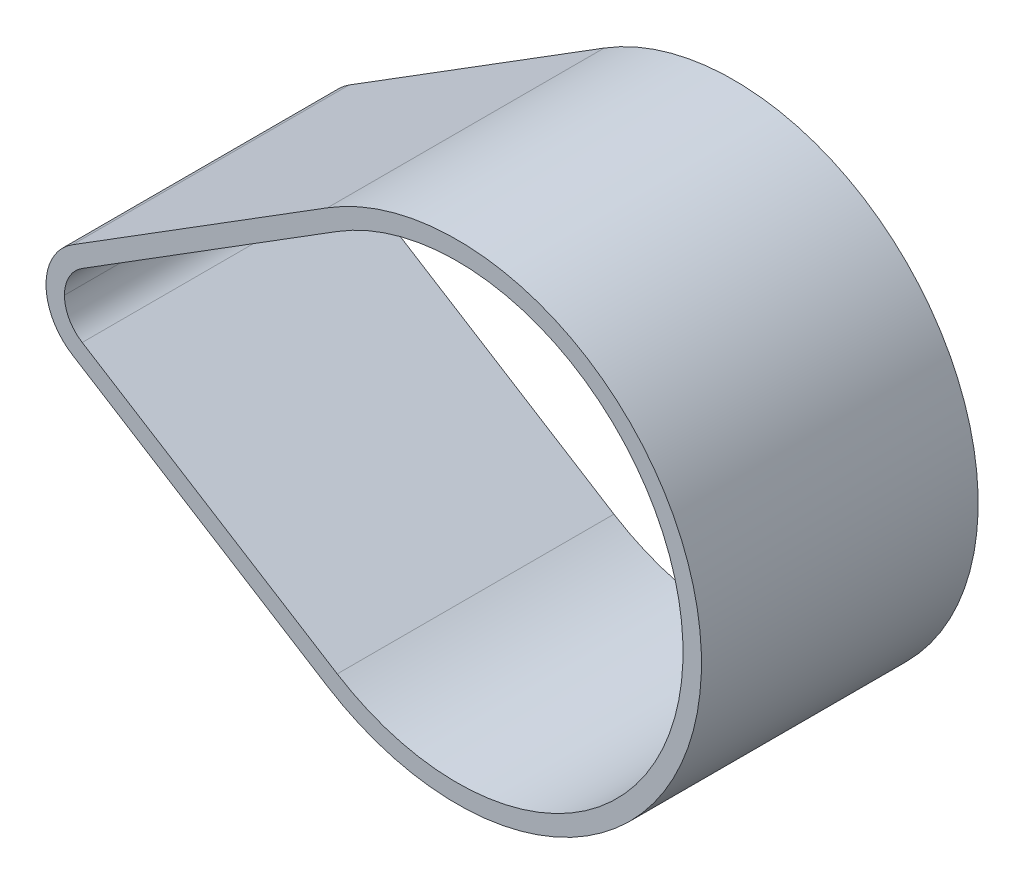
ISO-10303-21;
HEADER;
FILE_DESCRIPTION(('STEP AP214'),'2;1');
FILE_NAME('part.step','',(''),(''),'','','');
FILE_SCHEMA(('AUTOMOTIVE_DESIGN { 1 0 10303 214 1 1 1 1 }'));
ENDSEC;
DATA;
#1=APPLICATION_CONTEXT('core data for automotive mechanical design processes');
#2=APPLICATION_PROTOCOL_DEFINITION('international standard','automotive_design',2000,#1);
#3=PRODUCT_CONTEXT('',#1,'mechanical');
#4=PRODUCT('Part','Part','',(#3));
#5=PRODUCT_RELATED_PRODUCT_CATEGORY('part','',(#4));
#6=PRODUCT_DEFINITION_FORMATION('','',#4);
#7=PRODUCT_DEFINITION_CONTEXT('part definition',#1,'design');
#8=PRODUCT_DEFINITION('design','',#6,#7);
#9=PRODUCT_DEFINITION_SHAPE('','',#8);
#10=(LENGTH_UNIT() NAMED_UNIT(*) SI_UNIT(.MILLI.,.METRE.));
#11=(NAMED_UNIT(*) PLANE_ANGLE_UNIT() SI_UNIT($,.RADIAN.));
#12=(NAMED_UNIT(*) SI_UNIT($,.STERADIAN.) SOLID_ANGLE_UNIT());
#13=UNCERTAINTY_MEASURE_WITH_UNIT(LENGTH_MEASURE(1.E-05),#10,'distance_accuracy_value','');
#14=(GEOMETRIC_REPRESENTATION_CONTEXT(3) GLOBAL_UNCERTAINTY_ASSIGNED_CONTEXT((#13)) GLOBAL_UNIT_ASSIGNED_CONTEXT((#10,
#11,#12)) REPRESENTATION_CONTEXT('',''));
#15=CARTESIAN_POINT('',(0.,0.,0.));
#16=DIRECTION('',(0.,0.,1.));
#17=DIRECTION('',(1.,0.,0.));
#18=AXIS2_PLACEMENT_3D('',#15,#16,#17);
#19=CARTESIAN_POINT('',(0.,0.,30.));
#20=DIRECTION('',(0.,0.,-1.));
#21=DIRECTION('',(-1.,0.,0.));
#22=AXIS2_PLACEMENT_3D('',#19,#20,#21);
#23=CYLINDRICAL_SURFACE('',#22,4.1);
#24=CARTESIAN_POINT('',(0.,0.,30.));
#25=DIRECTION('',(0.,0.,1.));
#26=DIRECTION('',(1.,0.,0.));
#27=AXIS2_PLACEMENT_3D('',#24,#25,#26);
#28=CIRCLE('',#27,4.1);
#29=CARTESIAN_POINT('',(-2.17416168442942,3.47606400544625,30.));
#30=VERTEX_POINT('',#29);
#31=CARTESIAN_POINT('',(-4.1,0.,30.));
#32=VERTEX_POINT('',#31);
#33=EDGE_CURVE('E11',#30,#32,#28,.T.);
#34=ORIENTED_EDGE('',*,*,#33,.T.);
#35=DIRECTION('',(0.,0.,-1.));
#36=VECTOR('',#35,1.);
#37=CARTESIAN_POINT('',(-4.1,0.,30.));
#38=LINE('',#37,#36);
#39=CARTESIAN_POINT('',(-4.1,0.,0.));
#40=VERTEX_POINT('',#39);
#41=EDGE_CURVE('E27',#32,#40,#38,.T.);
#42=ORIENTED_EDGE('',*,*,#41,.T.);
#43=CARTESIAN_POINT('',(0.,0.,0.));
#44=DIRECTION('',(0.,0.,1.));
#45=DIRECTION('',(1.,0.,0.));
#46=AXIS2_PLACEMENT_3D('',#43,#44,#45);
#47=CIRCLE('',#46,4.1);
#48=CARTESIAN_POINT('',(-2.17416168442942,3.47606400544625,0.));
#49=VERTEX_POINT('',#48);
#50=EDGE_CURVE('E201',#49,#40,#47,.T.);
#51=ORIENTED_EDGE('',*,*,#50,.F.);
#52=DIRECTION('',(0.,0.,-1.));
#53=VECTOR('',#52,1.);
#54=CARTESIAN_POINT('',(-2.17416168442942,3.47606400544625,30.));
#55=LINE('',#54,#53);
#56=EDGE_CURVE('E207',#30,#49,#55,.T.);
#57=ORIENTED_EDGE('',*,*,#56,.F.);
#58=EDGE_LOOP('',(#34,#42,#51,#57));
#59=FACE_BOUND('',#58,.T.);
#60=ADVANCED_FACE('F16',(#59),#23,.F.);
#61=CARTESIAN_POINT('',(0.,0.,30.));
#62=DIRECTION('',(0.,0.,-1.));
#63=DIRECTION('',(-1.,0.,0.));
#64=AXIS2_PLACEMENT_3D('',#61,#62,#63);
#65=CYLINDRICAL_SURFACE('',#64,6.1);
#66=CARTESIAN_POINT('',(0.,0.,30.));
#67=DIRECTION('',(0.,0.,1.));
#68=DIRECTION('',(1.,0.,0.));
#69=AXIS2_PLACEMENT_3D('',#66,#67,#68);
#70=CIRCLE('',#69,6.1);
#71=CARTESIAN_POINT('',(-6.1,0.,30.));
#72=VERTEX_POINT('',#71);
#73=CARTESIAN_POINT('',(-3.23472835976085,-5.17170498371271,30.));
#74=VERTEX_POINT('',#73);
#75=EDGE_CURVE('E161',#72,#74,#70,.T.);
#76=ORIENTED_EDGE('',*,*,#75,.F.);
#77=DIRECTION('',(0.,0.,-1.));
#78=VECTOR('',#77,1.);
#79=CARTESIAN_POINT('',(-6.1,0.,30.));
#80=LINE('',#79,#78);
#81=CARTESIAN_POINT('',(-6.1,0.,0.));
#82=VERTEX_POINT('',#81);
#83=EDGE_CURVE('E137',#72,#82,#80,.T.);
#84=ORIENTED_EDGE('',*,*,#83,.T.);
#85=CARTESIAN_POINT('',(0.,0.,0.));
#86=DIRECTION('',(0.,0.,1.));
#87=DIRECTION('',(1.,0.,0.));
#88=AXIS2_PLACEMENT_3D('',#85,#86,#87);
#89=CIRCLE('',#88,6.1);
#90=CARTESIAN_POINT('',(-3.23472835976085,-5.17170498371271,0.));
#91=VERTEX_POINT('',#90);
#92=EDGE_CURVE('E20',#82,#91,#89,.T.);
#93=ORIENTED_EDGE('',*,*,#92,.T.);
#94=DIRECTION('',(0.,0.,-1.));
#95=VECTOR('',#94,1.);
#96=CARTESIAN_POINT('',(-3.23472835976085,-5.17170498371271,30.));
#97=LINE('',#96,#95);
#98=EDGE_CURVE('E115',#74,#91,#97,.T.);
#99=ORIENTED_EDGE('',*,*,#98,.F.);
#100=EDGE_LOOP('',(#76,#84,#93,#99));
#101=FACE_BOUND('',#100,.T.);
#102=ADVANCED_FACE('F135',(#101),#65,.T.);
#103=CARTESIAN_POINT('',(0.,0.,30.));
#104=DIRECTION('',(0.,0.,1.));
#105=DIRECTION('',(1.,0.,0.));
#106=AXIS2_PLACEMENT_3D('',#103,#104,#105);
#107=PLANE('',#106);
#108=CARTESIAN_POINT('',(0.,0.,30.));
#109=DIRECTION('',(0.,0.,1.));
#110=DIRECTION('',(1.,0.,0.));
#111=AXIS2_PLACEMENT_3D('',#108,#109,#110);
#112=CIRCLE('',#111,6.1);
#113=CARTESIAN_POINT('',(-3.23472835976085,5.17170498371271,30.));
#114=VERTEX_POINT('',#113);
#115=EDGE_CURVE('E142',#114,#72,#112,.T.);
#116=ORIENTED_EDGE('',*,*,#115,.T.);
#117=ORIENTED_EDGE('',*,*,#75,.T.);
#118=DIRECTION('',(0.847820489133231,-0.530283337665714,0.));
#119=VECTOR('',#118,1.);
#120=CARTESIAN_POINT('',(-3.23472835976085,-5.17170498371271,30.));
#121=LINE('',#120,#119);
#122=CARTESIAN_POINT('',(24.4174915518585,-22.4672429620306,30.));
#123=VERTEX_POINT('',#122);
#124=EDGE_CURVE('E130',#74,#123,#121,.T.);
#125=ORIENTED_EDGE('',*,*,#124,.T.);
#126=CARTESIAN_POINT('',(38.47,0.,30.));
#127=DIRECTION('',(0.,0.,1.));
#128=DIRECTION('',(1.,0.,0.));
#129=AXIS2_PLACEMENT_3D('',#126,#127,#128);
#130=CIRCLE('',#129,26.5);
#131=CARTESIAN_POINT('',(24.4174915518586,22.4672429620306,30.));
#132=VERTEX_POINT('',#131);
#133=EDGE_CURVE('E230',#123,#132,#130,.T.);
#134=ORIENTED_EDGE('',*,*,#133,.T.);
#135=DIRECTION('',(-0.847820489133231,-0.530283337665714,0.));
#136=VECTOR('',#135,1.);
#137=CARTESIAN_POINT('',(-3.23472835976085,5.17170498371271,30.));
#138=LINE('',#137,#136);
#139=EDGE_CURVE('E234',#132,#114,#138,.T.);
#140=ORIENTED_EDGE('',*,*,#139,.T.);
#141=EDGE_LOOP('',(#116,#117,#125,#134,#140));
#142=FACE_BOUND('',#141,.T.);
#143=DIRECTION('',(0.847820489133231,-0.530283337665714,0.));
#144=VECTOR('',#143,1.);
#145=CARTESIAN_POINT('',(-2.17416168442942,-3.47606400544624,30.));
#146=LINE('',#145,#144);
#147=CARTESIAN_POINT('',(-2.17416168442942,-3.47606400544624,30.));
#148=VERTEX_POINT('',#147);
#149=CARTESIAN_POINT('',(25.47805822719,-20.7716019837641,30.));
#150=VERTEX_POINT('',#149);
#151=EDGE_CURVE('E163',#148,#150,#146,.T.);
#152=ORIENTED_EDGE('',*,*,#151,.F.);
#153=CARTESIAN_POINT('',(0.,0.,30.));
#154=DIRECTION('',(0.,0.,1.));
#155=DIRECTION('',(1.,0.,0.));
#156=AXIS2_PLACEMENT_3D('',#153,#154,#155);
#157=CIRCLE('',#156,4.1);
#158=EDGE_CURVE('E196',#32,#148,#157,.T.);
#159=ORIENTED_EDGE('',*,*,#158,.F.);
#160=ORIENTED_EDGE('',*,*,#33,.F.);
#161=DIRECTION('',(-0.847820489133231,-0.530283337665714,0.));
#162=VECTOR('',#161,1.);
#163=CARTESIAN_POINT('',(-2.17416168442942,3.47606400544625,30.));
#164=LINE('',#163,#162);
#165=CARTESIAN_POINT('',(25.47805822719,20.7716019837641,30.));
#166=VERTEX_POINT('',#165);
#167=EDGE_CURVE('E209',#166,#30,#164,.T.);
#168=ORIENTED_EDGE('',*,*,#167,.F.);
#169=CARTESIAN_POINT('',(38.47,0.,30.));
#170=DIRECTION('',(0.,0.,1.));
#171=DIRECTION('',(1.,0.,0.));
#172=AXIS2_PLACEMENT_3D('',#169,#170,#171);
#173=CIRCLE('',#172,24.5);
#174=EDGE_CURVE('E169',#150,#166,#173,.T.);
#175=ORIENTED_EDGE('',*,*,#174,.F.);
#176=EDGE_LOOP('',(#152,#159,#160,#168,#175));
#177=FACE_BOUND('',#176,.T.);
#178=ADVANCED_FACE('F18',(#142,#177),#107,.T.);
#179=CARTESIAN_POINT('',(0.,0.,0.));
#180=DIRECTION('',(0.,0.,1.));
#181=DIRECTION('',(1.,0.,0.));
#182=AXIS2_PLACEMENT_3D('',#179,#180,#181);
#183=PLANE('',#182);
#184=CARTESIAN_POINT('',(0.,0.,0.));
#185=DIRECTION('',(0.,0.,1.));
#186=DIRECTION('',(1.,0.,0.));
#187=AXIS2_PLACEMENT_3D('',#184,#185,#186);
#188=CIRCLE('',#187,6.1);
#189=CARTESIAN_POINT('',(-3.23472835976085,5.17170498371271,0.));
#190=VERTEX_POINT('',#189);
#191=EDGE_CURVE('E149',#190,#82,#188,.T.);
#192=ORIENTED_EDGE('',*,*,#191,.F.);
#193=DIRECTION('',(-0.847820489133231,-0.530283337665714,0.));
#194=VECTOR('',#193,1.);
#195=CARTESIAN_POINT('',(-3.23472835976085,5.17170498371271,0.));
#196=LINE('',#195,#194);
#197=CARTESIAN_POINT('',(24.4174915518586,22.4672429620306,0.));
#198=VERTEX_POINT('',#197);
#199=EDGE_CURVE('E195',#198,#190,#196,.T.);
#200=ORIENTED_EDGE('',*,*,#199,.F.);
#201=CARTESIAN_POINT('',(38.47,0.,0.));
#202=DIRECTION('',(0.,0.,1.));
#203=DIRECTION('',(1.,0.,0.));
#204=AXIS2_PLACEMENT_3D('',#201,#202,#203);
#205=CIRCLE('',#204,26.5);
#206=CARTESIAN_POINT('',(24.4174915518585,-22.4672429620306,0.));
#207=VERTEX_POINT('',#206);
#208=EDGE_CURVE('E132',#207,#198,#205,.T.);
#209=ORIENTED_EDGE('',*,*,#208,.F.);
#210=DIRECTION('',(0.847820489133231,-0.530283337665714,0.));
#211=VECTOR('',#210,1.);
#212=CARTESIAN_POINT('',(-3.23472835976085,-5.17170498371271,0.));
#213=LINE('',#212,#211);
#214=EDGE_CURVE('E127',#91,#207,#213,.T.);
#215=ORIENTED_EDGE('',*,*,#214,.F.);
#216=ORIENTED_EDGE('',*,*,#92,.F.);
#217=EDGE_LOOP('',(#192,#200,#209,#215,#216));
#218=FACE_BOUND('',#217,.T.);
#219=ORIENTED_EDGE('',*,*,#50,.T.);
#220=CARTESIAN_POINT('',(0.,0.,0.));
#221=DIRECTION('',(0.,0.,1.));
#222=DIRECTION('',(1.,0.,0.));
#223=AXIS2_PLACEMENT_3D('',#220,#221,#222);
#224=CIRCLE('',#223,4.1);
#225=CARTESIAN_POINT('',(-2.17416168442942,-3.47606400544624,0.));
#226=VERTEX_POINT('',#225);
#227=EDGE_CURVE('E197',#40,#226,#224,.T.);
#228=ORIENTED_EDGE('',*,*,#227,.T.);
#229=DIRECTION('',(0.847820489133231,-0.530283337665714,0.));
#230=VECTOR('',#229,1.);
#231=CARTESIAN_POINT('',(-2.17416168442942,-3.47606400544624,0.));
#232=LINE('',#231,#230);
#233=CARTESIAN_POINT('',(25.47805822719,-20.7716019837641,0.));
#234=VERTEX_POINT('',#233);
#235=EDGE_CURVE('E187',#226,#234,#232,.T.);
#236=ORIENTED_EDGE('',*,*,#235,.T.);
#237=CARTESIAN_POINT('',(38.47,0.,0.));
#238=DIRECTION('',(0.,0.,1.));
#239=DIRECTION('',(1.,0.,0.));
#240=AXIS2_PLACEMENT_3D('',#237,#238,#239);
#241=CIRCLE('',#240,24.5);
#242=CARTESIAN_POINT('',(25.47805822719,20.7716019837641,0.));
#243=VERTEX_POINT('',#242);
#244=EDGE_CURVE('E82',#234,#243,#241,.T.);
#245=ORIENTED_EDGE('',*,*,#244,.T.);
#246=DIRECTION('',(-0.847820489133231,-0.530283337665714,0.));
#247=VECTOR('',#246,1.);
#248=CARTESIAN_POINT('',(-2.17416168442942,3.47606400544625,0.));
#249=LINE('',#248,#247);
#250=EDGE_CURVE('E69',#243,#49,#249,.T.);
#251=ORIENTED_EDGE('',*,*,#250,.T.);
#252=EDGE_LOOP('',(#219,#228,#236,#245,#251));
#253=FACE_BOUND('',#252,.T.);
#254=ADVANCED_FACE('F144',(#218,#253),#183,.F.);
#255=CARTESIAN_POINT('',(0.,0.,30.));
#256=DIRECTION('',(0.,0.,-1.));
#257=DIRECTION('',(-1.,0.,0.));
#258=AXIS2_PLACEMENT_3D('',#255,#256,#257);
#259=CYLINDRICAL_SURFACE('',#258,6.1);
#260=ORIENTED_EDGE('',*,*,#83,.F.);
#261=ORIENTED_EDGE('',*,*,#115,.F.);
#262=DIRECTION('',(0.,0.,-1.));
#263=VECTOR('',#262,1.);
#264=CARTESIAN_POINT('',(-3.23472835976085,5.17170498371271,30.));
#265=LINE('',#264,#263);
#266=EDGE_CURVE('E156',#114,#190,#265,.T.);
#267=ORIENTED_EDGE('',*,*,#266,.T.);
#268=ORIENTED_EDGE('',*,*,#191,.T.);
#269=EDGE_LOOP('',(#260,#261,#267,#268));
#270=FACE_BOUND('',#269,.T.);
#271=ADVANCED_FACE('F300',(#270),#259,.T.);
#272=CARTESIAN_POINT('',(-3.23472835976085,-5.17170498371271,30.));
#273=DIRECTION('',(0.530283337665714,0.847820489133231,0.));
#274=DIRECTION('',(0.,0.,-1.));
#275=AXIS2_PLACEMENT_3D('',#272,#273,#274);
#276=PLANE('',#275);
#277=ORIENTED_EDGE('',*,*,#214,.T.);
#278=DIRECTION('',(0.,0.,-1.));
#279=VECTOR('',#278,1.);
#280=CARTESIAN_POINT('',(24.4174915518585,-22.4672429620306,30.));
#281=LINE('',#280,#279);
#282=EDGE_CURVE('E223',#123,#207,#281,.T.);
#283=ORIENTED_EDGE('',*,*,#282,.F.);
#284=ORIENTED_EDGE('',*,*,#124,.F.);
#285=ORIENTED_EDGE('',*,*,#98,.T.);
#286=EDGE_LOOP('',(#277,#283,#284,#285));
#287=FACE_BOUND('',#286,.T.);
#288=ADVANCED_FACE('F124',(#287),#276,.F.);
#289=CARTESIAN_POINT('',(38.47,0.,30.));
#290=DIRECTION('',(0.,0.,-1.));
#291=DIRECTION('',(-1.,0.,0.));
#292=AXIS2_PLACEMENT_3D('',#289,#290,#291);
#293=CYLINDRICAL_SURFACE('',#292,26.5);
#294=ORIENTED_EDGE('',*,*,#208,.T.);
#295=DIRECTION('',(0.,0.,-1.));
#296=VECTOR('',#295,1.);
#297=CARTESIAN_POINT('',(24.4174915518586,22.4672429620306,30.));
#298=LINE('',#297,#296);
#299=EDGE_CURVE('E192',#132,#198,#298,.T.);
#300=ORIENTED_EDGE('',*,*,#299,.F.);
#301=ORIENTED_EDGE('',*,*,#133,.F.);
#302=ORIENTED_EDGE('',*,*,#282,.T.);
#303=EDGE_LOOP('',(#294,#300,#301,#302));
#304=FACE_BOUND('',#303,.T.);
#305=ADVANCED_FACE('F261',(#304),#293,.T.);
#306=CARTESIAN_POINT('',(-3.23472835976085,5.17170498371271,30.));
#307=DIRECTION('',(0.530283337665714,-0.847820489133231,0.));
#308=DIRECTION('',(0.,0.,-1.));
#309=AXIS2_PLACEMENT_3D('',#306,#307,#308);
#310=PLANE('',#309);
#311=ORIENTED_EDGE('',*,*,#199,.T.);
#312=ORIENTED_EDGE('',*,*,#266,.F.);
#313=ORIENTED_EDGE('',*,*,#139,.F.);
#314=ORIENTED_EDGE('',*,*,#299,.T.);
#315=EDGE_LOOP('',(#311,#312,#313,#314));
#316=FACE_BOUND('',#315,.T.);
#317=ADVANCED_FACE('F263',(#316),#310,.F.);
#318=CARTESIAN_POINT('',(0.,0.,30.));
#319=DIRECTION('',(0.,0.,-1.));
#320=DIRECTION('',(-1.,0.,0.));
#321=AXIS2_PLACEMENT_3D('',#318,#319,#320);
#322=CYLINDRICAL_SURFACE('',#321,4.1);
#323=ORIENTED_EDGE('',*,*,#41,.F.);
#324=ORIENTED_EDGE('',*,*,#158,.T.);
#325=DIRECTION('',(0.,0.,-1.));
#326=VECTOR('',#325,1.);
#327=CARTESIAN_POINT('',(-2.17416168442942,-3.47606400544624,30.));
#328=LINE('',#327,#326);
#329=EDGE_CURVE('E167',#148,#226,#328,.T.);
#330=ORIENTED_EDGE('',*,*,#329,.T.);
#331=ORIENTED_EDGE('',*,*,#227,.F.);
#332=EDGE_LOOP('',(#323,#324,#330,#331));
#333=FACE_BOUND('',#332,.T.);
#334=ADVANCED_FACE('F303',(#333),#322,.F.);
#335=CARTESIAN_POINT('',(-2.17416168442942,-3.47606400544624,30.));
#336=DIRECTION('',(0.530283337665714,0.847820489133231,0.));
#337=DIRECTION('',(0.,0.,-1.));
#338=AXIS2_PLACEMENT_3D('',#335,#336,#337);
#339=PLANE('',#338);
#340=ORIENTED_EDGE('',*,*,#235,.F.);
#341=ORIENTED_EDGE('',*,*,#329,.F.);
#342=ORIENTED_EDGE('',*,*,#151,.T.);
#343=DIRECTION('',(0.,0.,-1.));
#344=VECTOR('',#343,1.);
#345=CARTESIAN_POINT('',(25.47805822719,-20.7716019837641,30.));
#346=LINE('',#345,#344);
#347=EDGE_CURVE('E168',#150,#234,#346,.T.);
#348=ORIENTED_EDGE('',*,*,#347,.T.);
#349=EDGE_LOOP('',(#340,#341,#342,#348));
#350=FACE_BOUND('',#349,.T.);
#351=ADVANCED_FACE('F288',(#350),#339,.T.);
#352=CARTESIAN_POINT('',(38.47,0.,30.));
#353=DIRECTION('',(0.,0.,-1.));
#354=DIRECTION('',(-1.,0.,0.));
#355=AXIS2_PLACEMENT_3D('',#352,#353,#354);
#356=CYLINDRICAL_SURFACE('',#355,24.5);
#357=ORIENTED_EDGE('',*,*,#244,.F.);
#358=ORIENTED_EDGE('',*,*,#347,.F.);
#359=ORIENTED_EDGE('',*,*,#174,.T.);
#360=DIRECTION('',(0.,0.,-1.));
#361=VECTOR('',#360,1.);
#362=CARTESIAN_POINT('',(25.47805822719,20.7716019837641,30.));
#363=LINE('',#362,#361);
#364=EDGE_CURVE('E172',#166,#243,#363,.T.);
#365=ORIENTED_EDGE('',*,*,#364,.T.);
#366=EDGE_LOOP('',(#357,#358,#359,#365));
#367=FACE_BOUND('',#366,.T.);
#368=ADVANCED_FACE('F280',(#367),#356,.F.);
#369=CARTESIAN_POINT('',(-2.17416168442942,3.47606400544625,30.));
#370=DIRECTION('',(0.530283337665714,-0.847820489133231,0.));
#371=DIRECTION('',(0.,0.,-1.));
#372=AXIS2_PLACEMENT_3D('',#369,#370,#371);
#373=PLANE('',#372);
#374=ORIENTED_EDGE('',*,*,#250,.F.);
#375=ORIENTED_EDGE('',*,*,#364,.F.);
#376=ORIENTED_EDGE('',*,*,#167,.T.);
#377=ORIENTED_EDGE('',*,*,#56,.T.);
#378=EDGE_LOOP('',(#374,#375,#376,#377));
#379=FACE_BOUND('',#378,.T.);
#380=ADVANCED_FACE('F281',(#379),#373,.T.);
#381=CLOSED_SHELL('',(#60,#102,#178,#254,#271,#288,#305,#317,#334,#351,#368,#380));
#382=MANIFOLD_SOLID_BREP('B1',#381);
#383=ADVANCED_BREP_SHAPE_REPRESENTATION('',(#18,#382),#14);
#384=SHAPE_DEFINITION_REPRESENTATION(#9,#383);
ENDSEC;
END-ISO-10303-21;
